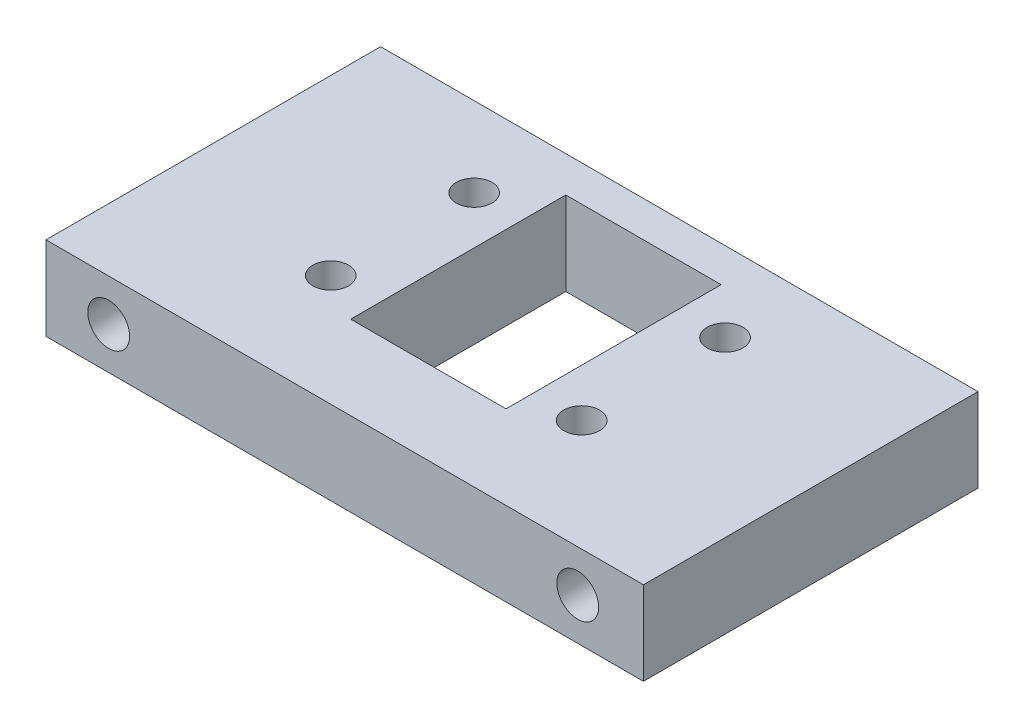
ISO-10303-21;
HEADER;
FILE_DESCRIPTION(('STEP AP214'),'2;1');
FILE_NAME('part.step','',(''),(''),'','','');
FILE_SCHEMA(('AUTOMOTIVE_DESIGN { 1 0 10303 214 1 1 1 1 }'));
ENDSEC;
DATA;
#1=APPLICATION_CONTEXT('core data for automotive mechanical design processes');
#2=APPLICATION_PROTOCOL_DEFINITION('international standard','automotive_design',2000,#1);
#3=PRODUCT_CONTEXT('',#1,'mechanical');
#4=PRODUCT('Part','Part','',(#3));
#5=PRODUCT_RELATED_PRODUCT_CATEGORY('part','',(#4));
#6=PRODUCT_DEFINITION_FORMATION('','',#4);
#7=PRODUCT_DEFINITION_CONTEXT('part definition',#1,'design');
#8=PRODUCT_DEFINITION('design','',#6,#7);
#9=PRODUCT_DEFINITION_SHAPE('','',#8);
#10=(LENGTH_UNIT() NAMED_UNIT(*) SI_UNIT(.MILLI.,.METRE.));
#11=(NAMED_UNIT(*) PLANE_ANGLE_UNIT() SI_UNIT($,.RADIAN.));
#12=(NAMED_UNIT(*) SI_UNIT($,.STERADIAN.) SOLID_ANGLE_UNIT());
#13=UNCERTAINTY_MEASURE_WITH_UNIT(LENGTH_MEASURE(1.E-05),#10,'distance_accuracy_value','');
#14=(GEOMETRIC_REPRESENTATION_CONTEXT(3) GLOBAL_UNCERTAINTY_ASSIGNED_CONTEXT((#13)) GLOBAL_UNIT_ASSIGNED_CONTEXT((#10,
#11,#12)) REPRESENTATION_CONTEXT('',''));
#15=CARTESIAN_POINT('',(0.,0.,0.));
#16=DIRECTION('',(0.,0.,1.));
#17=DIRECTION('',(1.,0.,0.));
#18=AXIS2_PLACEMENT_3D('',#15,#16,#17);
#19=CARTESIAN_POINT('',(0.,0.,28.));
#20=DIRECTION('',(1.,0.,0.));
#21=DIRECTION('',(0.,0.,-1.));
#22=AXIS2_PLACEMENT_3D('',#19,#20,#21);
#23=PLANE('',#22);
#24=DIRECTION('',(0.,-1.,0.));
#25=VECTOR('',#24,1.);
#26=CARTESIAN_POINT('',(0.,0.,0.));
#27=LINE('',#26,#25);
#28=CARTESIAN_POINT('',(0.,7.,0.));
#29=VERTEX_POINT('',#28);
#30=CARTESIAN_POINT('',(0.,0.,0.));
#31=VERTEX_POINT('',#30);
#32=EDGE_CURVE('E175',#29,#31,#27,.T.);
#33=ORIENTED_EDGE('',*,*,#32,.T.);
#34=DIRECTION('',(0.,0.,-1.));
#35=VECTOR('',#34,1.);
#36=CARTESIAN_POINT('',(0.,0.,28.));
#37=LINE('',#36,#35);
#38=CARTESIAN_POINT('',(0.,0.,28.));
#39=VERTEX_POINT('',#38);
#40=EDGE_CURVE('E11',#39,#31,#37,.T.);
#41=ORIENTED_EDGE('',*,*,#40,.F.);
#42=DIRECTION('',(0.,-1.,0.));
#43=VECTOR('',#42,1.);
#44=CARTESIAN_POINT('',(0.,0.,28.));
#45=LINE('',#44,#43);
#46=CARTESIAN_POINT('',(0.,7.,28.));
#47=VERTEX_POINT('',#46);
#48=EDGE_CURVE('E164',#47,#39,#45,.T.);
#49=ORIENTED_EDGE('',*,*,#48,.F.);
#50=DIRECTION('',(0.,0.,-1.));
#51=VECTOR('',#50,1.);
#52=CARTESIAN_POINT('',(0.,7.,28.));
#53=LINE('',#52,#51);
#54=EDGE_CURVE('E174',#47,#29,#53,.T.);
#55=ORIENTED_EDGE('',*,*,#54,.T.);
#56=EDGE_LOOP('',(#33,#41,#49,#55));
#57=FACE_BOUND('',#56,.T.);
#58=ADVANCED_FACE('F33',(#57),#23,.F.);
#59=CARTESIAN_POINT('',(0.,0.,28.));
#60=DIRECTION('',(0.,1.,0.));
#61=DIRECTION('',(0.,0.,1.));
#62=AXIS2_PLACEMENT_3D('',#59,#60,#61);
#63=PLANE('',#62);
#64=CARTESIAN_POINT('',(14.5,0.,18.6708596103808));
#65=DIRECTION('',(0.,1.,0.));
#66=DIRECTION('',(0.,0.,1.));
#67=AXIS2_PLACEMENT_3D('',#64,#65,#66);
#68=CIRCLE('',#67,1.5);
#69=CARTESIAN_POINT('',(14.5,0.,20.1708596103808));
#70=VERTEX_POINT('',#69);
#71=EDGE_CURVE('E138',#70,#70,#68,.T.);
#72=ORIENTED_EDGE('',*,*,#71,.T.);
#73=EDGE_LOOP('',(#72));
#74=FACE_BOUND('',#73,.T.);
#75=CARTESIAN_POINT('',(35.5,0.,6.67085961038083));
#76=DIRECTION('',(0.,1.,0.));
#77=DIRECTION('',(0.,0.,1.));
#78=AXIS2_PLACEMENT_3D('',#75,#76,#77);
#79=CIRCLE('',#78,1.5);
#80=CARTESIAN_POINT('',(35.5,0.,8.17085961038084));
#81=VERTEX_POINT('',#80);
#82=EDGE_CURVE('E145',#81,#81,#79,.T.);
#83=ORIENTED_EDGE('',*,*,#82,.T.);
#84=EDGE_LOOP('',(#83));
#85=FACE_BOUND('',#84,.T.);
#86=CARTESIAN_POINT('',(35.5,0.,18.6708596103808));
#87=DIRECTION('',(0.,1.,0.));
#88=DIRECTION('',(0.,0.,1.));
#89=AXIS2_PLACEMENT_3D('',#86,#87,#88);
#90=CIRCLE('',#89,1.5);
#91=CARTESIAN_POINT('',(35.5,0.,20.1708596103808));
#92=VERTEX_POINT('',#91);
#93=EDGE_CURVE('E151',#92,#92,#90,.T.);
#94=ORIENTED_EDGE('',*,*,#93,.T.);
#95=EDGE_LOOP('',(#94));
#96=FACE_BOUND('',#95,.T.);
#97=DIRECTION('',(-1.,0.,0.));
#98=VECTOR('',#97,1.);
#99=CARTESIAN_POINT('',(18.5,0.,3.));
#100=LINE('',#99,#98);
#101=CARTESIAN_POINT('',(31.5,0.,3.));
#102=VERTEX_POINT('',#101);
#103=CARTESIAN_POINT('',(18.5,0.,3.));
#104=VERTEX_POINT('',#103);
#105=EDGE_CURVE('E107',#102,#104,#100,.T.);
#106=ORIENTED_EDGE('',*,*,#105,.T.);
#107=DIRECTION('',(0.,0.,1.));
#108=VECTOR('',#107,1.);
#109=CARTESIAN_POINT('',(18.5,0.,3.));
#110=LINE('',#109,#108);
#111=CARTESIAN_POINT('',(18.5,0.,21.));
#112=VERTEX_POINT('',#111);
#113=EDGE_CURVE('E101',#104,#112,#110,.T.);
#114=ORIENTED_EDGE('',*,*,#113,.T.);
#115=DIRECTION('',(1.,0.,0.));
#116=VECTOR('',#115,1.);
#117=CARTESIAN_POINT('',(18.5,0.,21.));
#118=LINE('',#117,#116);
#119=CARTESIAN_POINT('',(31.5,0.,21.));
#120=VERTEX_POINT('',#119);
#121=EDGE_CURVE('E110',#112,#120,#118,.T.);
#122=ORIENTED_EDGE('',*,*,#121,.T.);
#123=DIRECTION('',(0.,0.,-1.));
#124=VECTOR('',#123,1.);
#125=CARTESIAN_POINT('',(31.5,0.,3.));
#126=LINE('',#125,#124);
#127=EDGE_CURVE('E49',#120,#102,#126,.T.);
#128=ORIENTED_EDGE('',*,*,#127,.T.);
#129=EDGE_LOOP('',(#106,#114,#122,#128));
#130=FACE_BOUND('',#129,.T.);
#131=CARTESIAN_POINT('',(14.5,0.,6.67085961038083));
#132=DIRECTION('',(0.,1.,0.));
#133=DIRECTION('',(0.,0.,1.));
#134=AXIS2_PLACEMENT_3D('',#131,#132,#133);
#135=CIRCLE('',#134,1.5);
#136=CARTESIAN_POINT('',(14.5,0.,8.17085961038084));
#137=VERTEX_POINT('',#136);
#138=EDGE_CURVE('E152',#137,#137,#135,.T.);
#139=ORIENTED_EDGE('',*,*,#138,.T.);
#140=EDGE_LOOP('',(#139));
#141=FACE_BOUND('',#140,.T.);
#142=DIRECTION('',(1.,0.,0.));
#143=VECTOR('',#142,1.);
#144=CARTESIAN_POINT('',(0.,0.,0.));
#145=LINE('',#144,#143);
#146=CARTESIAN_POINT('',(50.,0.,0.));
#147=VERTEX_POINT('',#146);
#148=EDGE_CURVE('E178',#31,#147,#145,.T.);
#149=ORIENTED_EDGE('',*,*,#148,.T.);
#150=DIRECTION('',(0.,0.,-1.));
#151=VECTOR('',#150,1.);
#152=CARTESIAN_POINT('',(50.,0.,28.));
#153=LINE('',#152,#151);
#154=CARTESIAN_POINT('',(50.,0.,28.));
#155=VERTEX_POINT('',#154);
#156=EDGE_CURVE('E41',#155,#147,#153,.T.);
#157=ORIENTED_EDGE('',*,*,#156,.F.);
#158=DIRECTION('',(1.,0.,0.));
#159=VECTOR('',#158,1.);
#160=CARTESIAN_POINT('',(0.,0.,28.));
#161=LINE('',#160,#159);
#162=EDGE_CURVE('E167',#39,#155,#161,.T.);
#163=ORIENTED_EDGE('',*,*,#162,.F.);
#164=ORIENTED_EDGE('',*,*,#40,.T.);
#165=EDGE_LOOP('',(#149,#157,#163,#164));
#166=FACE_BOUND('',#165,.T.);
#167=ADVANCED_FACE('F114',(#74,#85,#96,#130,#141,#166),#63,.F.);
#168=CARTESIAN_POINT('',(50.,0.,28.));
#169=DIRECTION('',(-1.,0.,0.));
#170=DIRECTION('',(0.,0.,1.));
#171=AXIS2_PLACEMENT_3D('',#168,#169,#170);
#172=PLANE('',#171);
#173=DIRECTION('',(0.,1.,0.));
#174=VECTOR('',#173,1.);
#175=CARTESIAN_POINT('',(50.,0.,0.));
#176=LINE('',#175,#174);
#177=CARTESIAN_POINT('',(50.,7.,0.));
#178=VERTEX_POINT('',#177);
#179=EDGE_CURVE('E180',#147,#178,#176,.T.);
#180=ORIENTED_EDGE('',*,*,#179,.T.);
#181=DIRECTION('',(0.,0.,-1.));
#182=VECTOR('',#181,1.);
#183=CARTESIAN_POINT('',(50.,7.,28.));
#184=LINE('',#183,#182);
#185=CARTESIAN_POINT('',(50.,7.,28.));
#186=VERTEX_POINT('',#185);
#187=EDGE_CURVE('E185',#186,#178,#184,.T.);
#188=ORIENTED_EDGE('',*,*,#187,.F.);
#189=DIRECTION('',(0.,1.,0.));
#190=VECTOR('',#189,1.);
#191=CARTESIAN_POINT('',(50.,0.,28.));
#192=LINE('',#191,#190);
#193=EDGE_CURVE('E170',#155,#186,#192,.T.);
#194=ORIENTED_EDGE('',*,*,#193,.F.);
#195=ORIENTED_EDGE('',*,*,#156,.T.);
#196=EDGE_LOOP('',(#180,#188,#194,#195));
#197=FACE_BOUND('',#196,.T.);
#198=ADVANCED_FACE('F218',(#197),#172,.F.);
#199=CARTESIAN_POINT('',(0.,7.,28.));
#200=DIRECTION('',(0.,-1.,0.));
#201=DIRECTION('',(0.,0.,-1.));
#202=AXIS2_PLACEMENT_3D('',#199,#200,#201);
#203=PLANE('',#202);
#204=CARTESIAN_POINT('',(14.5,7.,18.6708596103808));
#205=DIRECTION('',(0.,1.,0.));
#206=DIRECTION('',(0.,0.,1.));
#207=AXIS2_PLACEMENT_3D('',#204,#205,#206);
#208=CIRCLE('',#207,1.5);
#209=CARTESIAN_POINT('',(14.5,7.,20.1708596103808));
#210=VERTEX_POINT('',#209);
#211=EDGE_CURVE('E142',#210,#210,#208,.T.);
#212=ORIENTED_EDGE('',*,*,#211,.F.);
#213=EDGE_LOOP('',(#212));
#214=FACE_BOUND('',#213,.T.);
#215=CARTESIAN_POINT('',(35.5,7.,6.67085961038083));
#216=DIRECTION('',(0.,1.,0.));
#217=DIRECTION('',(0.,0.,1.));
#218=AXIS2_PLACEMENT_3D('',#215,#216,#217);
#219=CIRCLE('',#218,1.5);
#220=CARTESIAN_POINT('',(35.5,7.,8.17085961038084));
#221=VERTEX_POINT('',#220);
#222=EDGE_CURVE('E148',#221,#221,#219,.T.);
#223=ORIENTED_EDGE('',*,*,#222,.F.);
#224=EDGE_LOOP('',(#223));
#225=FACE_BOUND('',#224,.T.);
#226=CARTESIAN_POINT('',(35.5,7.,18.6708596103808));
#227=DIRECTION('',(0.,1.,0.));
#228=DIRECTION('',(0.,0.,1.));
#229=AXIS2_PLACEMENT_3D('',#226,#227,#228);
#230=CIRCLE('',#229,1.5);
#231=CARTESIAN_POINT('',(35.5,7.,20.1708596103808));
#232=VERTEX_POINT('',#231);
#233=EDGE_CURVE('E123',#232,#232,#230,.T.);
#234=ORIENTED_EDGE('',*,*,#233,.F.);
#235=EDGE_LOOP('',(#234));
#236=FACE_BOUND('',#235,.T.);
#237=DIRECTION('',(1.,0.,0.));
#238=VECTOR('',#237,1.);
#239=CARTESIAN_POINT('',(18.5,7.,21.));
#240=LINE('',#239,#238);
#241=CARTESIAN_POINT('',(18.5,7.,21.));
#242=VERTEX_POINT('',#241);
#243=CARTESIAN_POINT('',(31.5,7.,21.));
#244=VERTEX_POINT('',#243);
#245=EDGE_CURVE('E129',#242,#244,#240,.T.);
#246=ORIENTED_EDGE('',*,*,#245,.F.);
#247=DIRECTION('',(0.,0.,1.));
#248=VECTOR('',#247,1.);
#249=CARTESIAN_POINT('',(18.5,7.,3.));
#250=LINE('',#249,#248);
#251=CARTESIAN_POINT('',(18.5,7.,3.));
#252=VERTEX_POINT('',#251);
#253=EDGE_CURVE('E57',#252,#242,#250,.T.);
#254=ORIENTED_EDGE('',*,*,#253,.F.);
#255=DIRECTION('',(-1.,0.,0.));
#256=VECTOR('',#255,1.);
#257=CARTESIAN_POINT('',(18.5,7.,3.));
#258=LINE('',#257,#256);
#259=CARTESIAN_POINT('',(31.5,7.,3.));
#260=VERTEX_POINT('',#259);
#261=EDGE_CURVE('E117',#260,#252,#258,.T.);
#262=ORIENTED_EDGE('',*,*,#261,.F.);
#263=DIRECTION('',(0.,0.,-1.));
#264=VECTOR('',#263,1.);
#265=CARTESIAN_POINT('',(31.5,7.,3.));
#266=LINE('',#265,#264);
#267=EDGE_CURVE('E120',#244,#260,#266,.T.);
#268=ORIENTED_EDGE('',*,*,#267,.F.);
#269=EDGE_LOOP('',(#246,#254,#262,#268));
#270=FACE_BOUND('',#269,.T.);
#271=CARTESIAN_POINT('',(14.5,7.,6.67085961038083));
#272=DIRECTION('',(0.,1.,0.));
#273=DIRECTION('',(0.,0.,1.));
#274=AXIS2_PLACEMENT_3D('',#271,#272,#273);
#275=CIRCLE('',#274,1.5);
#276=CARTESIAN_POINT('',(14.5,7.,8.17085961038084));
#277=VERTEX_POINT('',#276);
#278=EDGE_CURVE('E141',#277,#277,#275,.T.);
#279=ORIENTED_EDGE('',*,*,#278,.F.);
#280=EDGE_LOOP('',(#279));
#281=FACE_BOUND('',#280,.T.);
#282=DIRECTION('',(-1.,0.,0.));
#283=VECTOR('',#282,1.);
#284=CARTESIAN_POINT('',(0.,7.,0.));
#285=LINE('',#284,#283);
#286=EDGE_CURVE('E168',#178,#29,#285,.T.);
#287=ORIENTED_EDGE('',*,*,#286,.T.);
#288=ORIENTED_EDGE('',*,*,#54,.F.);
#289=DIRECTION('',(-1.,0.,0.));
#290=VECTOR('',#289,1.);
#291=CARTESIAN_POINT('',(0.,7.,28.));
#292=LINE('',#291,#290);
#293=EDGE_CURVE('E172',#186,#47,#292,.T.);
#294=ORIENTED_EDGE('',*,*,#293,.F.);
#295=ORIENTED_EDGE('',*,*,#187,.T.);
#296=EDGE_LOOP('',(#287,#288,#294,#295));
#297=FACE_BOUND('',#296,.T.);
#298=ADVANCED_FACE('F214',(#214,#225,#236,#270,#281,#297),#203,.F.);
#299=CARTESIAN_POINT('',(0.,0.,28.));
#300=DIRECTION('',(0.,0.,-1.));
#301=DIRECTION('',(-1.,0.,0.));
#302=AXIS2_PLACEMENT_3D('',#299,#300,#301);
#303=PLANE('',#302);
#304=CARTESIAN_POINT('',(5.25,3.5,28.));
#305=DIRECTION('',(0.,0.,1.));
#306=DIRECTION('',(1.,0.,0.));
#307=AXIS2_PLACEMENT_3D('',#304,#305,#306);
#308=CIRCLE('',#307,1.75);
#309=CARTESIAN_POINT('',(7.,3.5,28.));
#310=VERTEX_POINT('',#309);
#311=EDGE_CURVE('E158',#310,#310,#308,.T.);
#312=ORIENTED_EDGE('',*,*,#311,.F.);
#313=EDGE_LOOP('',(#312));
#314=FACE_BOUND('',#313,.T.);
#315=CARTESIAN_POINT('',(44.5,3.5,28.));
#316=DIRECTION('',(0.,0.,1.));
#317=DIRECTION('',(1.,0.,0.));
#318=AXIS2_PLACEMENT_3D('',#315,#316,#317);
#319=CIRCLE('',#318,1.75);
#320=CARTESIAN_POINT('',(46.25,3.5,28.));
#321=VERTEX_POINT('',#320);
#322=EDGE_CURVE('E155',#321,#321,#319,.T.);
#323=ORIENTED_EDGE('',*,*,#322,.F.);
#324=EDGE_LOOP('',(#323));
#325=FACE_BOUND('',#324,.T.);
#326=ORIENTED_EDGE('',*,*,#48,.T.);
#327=ORIENTED_EDGE('',*,*,#162,.T.);
#328=ORIENTED_EDGE('',*,*,#193,.T.);
#329=ORIENTED_EDGE('',*,*,#293,.T.);
#330=EDGE_LOOP('',(#326,#327,#328,#329));
#331=FACE_BOUND('',#330,.T.);
#332=ADVANCED_FACE('F202',(#314,#325,#331),#303,.F.);
#333=CARTESIAN_POINT('',(0.,0.,0.));
#334=DIRECTION('',(0.,0.,-1.));
#335=DIRECTION('',(-1.,0.,0.));
#336=AXIS2_PLACEMENT_3D('',#333,#334,#335);
#337=PLANE('',#336);
#338=CARTESIAN_POINT('',(5.25,3.5,0.));
#339=DIRECTION('',(0.,0.,-1.));
#340=DIRECTION('',(-1.,0.,0.));
#341=AXIS2_PLACEMENT_3D('',#338,#339,#340);
#342=CIRCLE('',#341,1.75);
#343=CARTESIAN_POINT('',(3.5,3.5,0.));
#344=VERTEX_POINT('',#343);
#345=EDGE_CURVE('E36',#344,#344,#342,.T.);
#346=ORIENTED_EDGE('',*,*,#345,.F.);
#347=EDGE_LOOP('',(#346));
#348=FACE_BOUND('',#347,.T.);
#349=CARTESIAN_POINT('',(44.5,3.5,0.));
#350=DIRECTION('',(0.,0.,-1.));
#351=DIRECTION('',(-1.,0.,0.));
#352=AXIS2_PLACEMENT_3D('',#349,#350,#351);
#353=CIRCLE('',#352,1.75);
#354=CARTESIAN_POINT('',(42.75,3.5,0.));
#355=VERTEX_POINT('',#354);
#356=EDGE_CURVE('E161',#355,#355,#353,.T.);
#357=ORIENTED_EDGE('',*,*,#356,.F.);
#358=EDGE_LOOP('',(#357));
#359=FACE_BOUND('',#358,.T.);
#360=ORIENTED_EDGE('',*,*,#32,.F.);
#361=ORIENTED_EDGE('',*,*,#286,.F.);
#362=ORIENTED_EDGE('',*,*,#179,.F.);
#363=ORIENTED_EDGE('',*,*,#148,.F.);
#364=EDGE_LOOP('',(#360,#361,#362,#363));
#365=FACE_BOUND('',#364,.T.);
#366=ADVANCED_FACE('F198',(#348,#359,#365),#337,.T.);
#367=CARTESIAN_POINT('',(44.5,3.5,-42.));
#368=DIRECTION('',(0.,0.,1.));
#369=DIRECTION('',(1.,0.,0.));
#370=AXIS2_PLACEMENT_3D('',#367,#368,#369);
#371=CYLINDRICAL_SURFACE('',#370,1.75);
#372=ORIENTED_EDGE('',*,*,#356,.T.);
#373=EDGE_LOOP('',(#372));
#374=FACE_BOUND('',#373,.T.);
#375=ORIENTED_EDGE('',*,*,#322,.T.);
#376=EDGE_LOOP('',(#375));
#377=FACE_BOUND('',#376,.T.);
#378=ADVANCED_FACE('F201',(#374,#377),#371,.F.);
#379=CARTESIAN_POINT('',(5.25,3.5,-42.));
#380=DIRECTION('',(0.,0.,1.));
#381=DIRECTION('',(1.,0.,0.));
#382=AXIS2_PLACEMENT_3D('',#379,#380,#381);
#383=CYLINDRICAL_SURFACE('',#382,1.75);
#384=ORIENTED_EDGE('',*,*,#345,.T.);
#385=EDGE_LOOP('',(#384));
#386=FACE_BOUND('',#385,.T.);
#387=ORIENTED_EDGE('',*,*,#311,.T.);
#388=EDGE_LOOP('',(#387));
#389=FACE_BOUND('',#388,.T.);
#390=ADVANCED_FACE('F195',(#386,#389),#383,.F.);
#391=CARTESIAN_POINT('',(14.5,0.,6.67085961038083));
#392=DIRECTION('',(0.,1.,0.));
#393=DIRECTION('',(0.,0.,1.));
#394=AXIS2_PLACEMENT_3D('',#391,#392,#393);
#395=CYLINDRICAL_SURFACE('',#394,1.5);
#396=ORIENTED_EDGE('',*,*,#138,.F.);
#397=EDGE_LOOP('',(#396));
#398=FACE_BOUND('',#397,.T.);
#399=ORIENTED_EDGE('',*,*,#278,.T.);
#400=EDGE_LOOP('',(#399));
#401=FACE_BOUND('',#400,.T.);
#402=ADVANCED_FACE('F259',(#398,#401),#395,.F.);
#403=CARTESIAN_POINT('',(18.5,0.,3.));
#404=DIRECTION('',(-1.,0.,0.));
#405=DIRECTION('',(0.,0.,1.));
#406=AXIS2_PLACEMENT_3D('',#403,#404,#405);
#407=PLANE('',#406);
#408=ORIENTED_EDGE('',*,*,#253,.T.);
#409=DIRECTION('',(0.,1.,0.));
#410=VECTOR('',#409,1.);
#411=CARTESIAN_POINT('',(18.5,0.,21.));
#412=LINE('',#411,#410);
#413=EDGE_CURVE('E97',#112,#242,#412,.T.);
#414=ORIENTED_EDGE('',*,*,#413,.F.);
#415=ORIENTED_EDGE('',*,*,#113,.F.);
#416=DIRECTION('',(0.,1.,0.));
#417=VECTOR('',#416,1.);
#418=CARTESIAN_POINT('',(18.5,0.,3.));
#419=LINE('',#418,#417);
#420=EDGE_CURVE('E133',#104,#252,#419,.T.);
#421=ORIENTED_EDGE('',*,*,#420,.T.);
#422=EDGE_LOOP('',(#408,#414,#415,#421));
#423=FACE_BOUND('',#422,.T.);
#424=ADVANCED_FACE('F99',(#423),#407,.F.);
#425=CARTESIAN_POINT('',(18.5,0.,3.));
#426=DIRECTION('',(0.,0.,-1.));
#427=DIRECTION('',(-1.,0.,0.));
#428=AXIS2_PLACEMENT_3D('',#425,#426,#427);
#429=PLANE('',#428);
#430=ORIENTED_EDGE('',*,*,#261,.T.);
#431=ORIENTED_EDGE('',*,*,#420,.F.);
#432=ORIENTED_EDGE('',*,*,#105,.F.);
#433=DIRECTION('',(0.,1.,0.));
#434=VECTOR('',#433,1.);
#435=CARTESIAN_POINT('',(31.5,0.,3.));
#436=LINE('',#435,#434);
#437=EDGE_CURVE('E135',#102,#260,#436,.T.);
#438=ORIENTED_EDGE('',*,*,#437,.T.);
#439=EDGE_LOOP('',(#430,#431,#432,#438));
#440=FACE_BOUND('',#439,.T.);
#441=ADVANCED_FACE('F267',(#440),#429,.F.);
#442=CARTESIAN_POINT('',(31.5,0.,3.));
#443=DIRECTION('',(1.,0.,0.));
#444=DIRECTION('',(0.,0.,-1.));
#445=AXIS2_PLACEMENT_3D('',#442,#443,#444);
#446=PLANE('',#445);
#447=ORIENTED_EDGE('',*,*,#267,.T.);
#448=ORIENTED_EDGE('',*,*,#437,.F.);
#449=ORIENTED_EDGE('',*,*,#127,.F.);
#450=DIRECTION('',(0.,1.,0.));
#451=VECTOR('',#450,1.);
#452=CARTESIAN_POINT('',(31.5,0.,21.));
#453=LINE('',#452,#451);
#454=EDGE_CURVE('E106',#120,#244,#453,.T.);
#455=ORIENTED_EDGE('',*,*,#454,.T.);
#456=EDGE_LOOP('',(#447,#448,#449,#455));
#457=FACE_BOUND('',#456,.T.);
#458=ADVANCED_FACE('F317',(#457),#446,.F.);
#459=CARTESIAN_POINT('',(18.5,0.,21.));
#460=DIRECTION('',(0.,0.,1.));
#461=DIRECTION('',(1.,0.,0.));
#462=AXIS2_PLACEMENT_3D('',#459,#460,#461);
#463=PLANE('',#462);
#464=ORIENTED_EDGE('',*,*,#245,.T.);
#465=ORIENTED_EDGE('',*,*,#454,.F.);
#466=ORIENTED_EDGE('',*,*,#121,.F.);
#467=ORIENTED_EDGE('',*,*,#413,.T.);
#468=EDGE_LOOP('',(#464,#465,#466,#467));
#469=FACE_BOUND('',#468,.T.);
#470=ADVANCED_FACE('F111',(#469),#463,.F.);
#471=CARTESIAN_POINT('',(35.5,0.,18.6708596103808));
#472=DIRECTION('',(0.,1.,0.));
#473=DIRECTION('',(0.,0.,1.));
#474=AXIS2_PLACEMENT_3D('',#471,#472,#473);
#475=CYLINDRICAL_SURFACE('',#474,1.5);
#476=ORIENTED_EDGE('',*,*,#93,.F.);
#477=EDGE_LOOP('',(#476));
#478=FACE_BOUND('',#477,.T.);
#479=ORIENTED_EDGE('',*,*,#233,.T.);
#480=EDGE_LOOP('',(#479));
#481=FACE_BOUND('',#480,.T.);
#482=ADVANCED_FACE('F252',(#478,#481),#475,.F.);
#483=CARTESIAN_POINT('',(35.5,0.,6.67085961038083));
#484=DIRECTION('',(0.,1.,0.));
#485=DIRECTION('',(0.,0.,1.));
#486=AXIS2_PLACEMENT_3D('',#483,#484,#485);
#487=CYLINDRICAL_SURFACE('',#486,1.5);
#488=ORIENTED_EDGE('',*,*,#82,.F.);
#489=EDGE_LOOP('',(#488));
#490=FACE_BOUND('',#489,.T.);
#491=ORIENTED_EDGE('',*,*,#222,.T.);
#492=EDGE_LOOP('',(#491));
#493=FACE_BOUND('',#492,.T.);
#494=ADVANCED_FACE('F272',(#490,#493),#487,.F.);
#495=CARTESIAN_POINT('',(14.5,0.,18.6708596103808));
#496=DIRECTION('',(0.,1.,0.));
#497=DIRECTION('',(0.,0.,1.));
#498=AXIS2_PLACEMENT_3D('',#495,#496,#497);
#499=CYLINDRICAL_SURFACE('',#498,1.5);
#500=ORIENTED_EDGE('',*,*,#71,.F.);
#501=EDGE_LOOP('',(#500));
#502=FACE_BOUND('',#501,.T.);
#503=ORIENTED_EDGE('',*,*,#211,.T.);
#504=EDGE_LOOP('',(#503));
#505=FACE_BOUND('',#504,.T.);
#506=ADVANCED_FACE('F351',(#502,#505),#499,.F.);
#507=CLOSED_SHELL('',(#58,#167,#198,#298,#332,#366,#378,#390,#402,#424,#441,#458,#470,#482,#494,#506));
#508=MANIFOLD_SOLID_BREP('B2',#507);
#509=ADVANCED_BREP_SHAPE_REPRESENTATION('',(#18,#508),#14);
#510=SHAPE_DEFINITION_REPRESENTATION(#9,#509);
ENDSEC;
END-ISO-10303-21;
